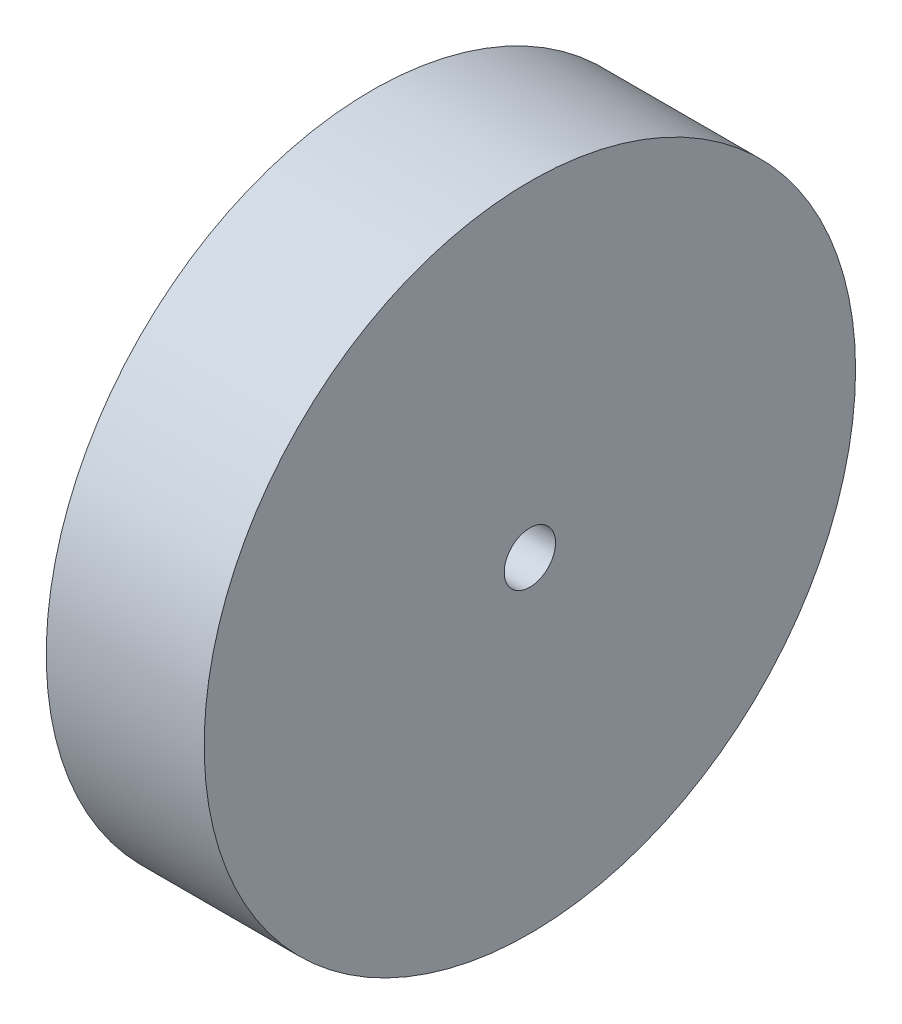
ISO-10303-21;
HEADER;
FILE_DESCRIPTION(('STEP AP214'),'2;1');
FILE_NAME('part.step','',(''),(''),'','','');
FILE_SCHEMA(('AUTOMOTIVE_DESIGN { 1 0 10303 214 1 1 1 1 }'));
ENDSEC;
DATA;
#1=APPLICATION_CONTEXT('core data for automotive mechanical design processes');
#2=APPLICATION_PROTOCOL_DEFINITION('international standard','automotive_design',2000,#1);
#3=PRODUCT_CONTEXT('',#1,'mechanical');
#4=PRODUCT('Part','Part','',(#3));
#5=PRODUCT_RELATED_PRODUCT_CATEGORY('part','',(#4));
#6=PRODUCT_DEFINITION_FORMATION('','',#4);
#7=PRODUCT_DEFINITION_CONTEXT('part definition',#1,'design');
#8=PRODUCT_DEFINITION('design','',#6,#7);
#9=PRODUCT_DEFINITION_SHAPE('','',#8);
#10=(LENGTH_UNIT() NAMED_UNIT(*) SI_UNIT(.MILLI.,.METRE.));
#11=(NAMED_UNIT(*) PLANE_ANGLE_UNIT() SI_UNIT($,.RADIAN.));
#12=(NAMED_UNIT(*) SI_UNIT($,.STERADIAN.) SOLID_ANGLE_UNIT());
#13=UNCERTAINTY_MEASURE_WITH_UNIT(LENGTH_MEASURE(1.E-05),#10,'distance_accuracy_value','');
#14=(GEOMETRIC_REPRESENTATION_CONTEXT(3) GLOBAL_UNCERTAINTY_ASSIGNED_CONTEXT((#13)) GLOBAL_UNIT_ASSIGNED_CONTEXT((#10,
#11,#12)) REPRESENTATION_CONTEXT('',''));
#15=CARTESIAN_POINT('',(0.,0.,0.));
#16=DIRECTION('',(0.,0.,1.));
#17=DIRECTION('',(1.,0.,0.));
#18=AXIS2_PLACEMENT_3D('',#15,#16,#17);
#19=CARTESIAN_POINT('',(16.,0.,0.));
#20=DIRECTION('',(-1.,0.,0.));
#21=DIRECTION('',(0.,0.,1.));
#22=AXIS2_PLACEMENT_3D('',#19,#20,#21);
#23=CYLINDRICAL_SURFACE('',#22,33.);
#24=CARTESIAN_POINT('',(16.,0.,0.));
#25=DIRECTION('',(1.,0.,0.));
#26=DIRECTION('',(0.,0.,-1.));
#27=AXIS2_PLACEMENT_3D('',#24,#25,#26);
#28=CIRCLE('',#27,33.);
#29=CARTESIAN_POINT('',(16.,0.,-33.));
#30=VERTEX_POINT('',#29);
#31=EDGE_CURVE('E10',#30,#30,#28,.T.);
#32=ORIENTED_EDGE('',*,*,#31,.F.);
#33=EDGE_LOOP('',(#32));
#34=FACE_BOUND('',#33,.T.);
#35=CARTESIAN_POINT('',(0.,0.,0.));
#36=DIRECTION('',(1.,0.,0.));
#37=DIRECTION('',(0.,0.,-1.));
#38=AXIS2_PLACEMENT_3D('',#35,#36,#37);
#39=CIRCLE('',#38,33.);
#40=CARTESIAN_POINT('',(0.,0.,-33.));
#41=VERTEX_POINT('',#40);
#42=EDGE_CURVE('E36',#41,#41,#39,.T.);
#43=ORIENTED_EDGE('',*,*,#42,.T.);
#44=EDGE_LOOP('',(#43));
#45=FACE_BOUND('',#44,.T.);
#46=ADVANCED_FACE('F33',(#34,#45),#23,.T.);
#47=CARTESIAN_POINT('',(16.,0.,0.));
#48=DIRECTION('',(1.,0.,0.));
#49=DIRECTION('',(0.,0.,-1.));
#50=AXIS2_PLACEMENT_3D('',#47,#48,#49);
#51=PLANE('',#50);
#52=CARTESIAN_POINT('',(16.,0.,0.));
#53=DIRECTION('',(1.,0.,0.));
#54=DIRECTION('',(0.,0.,-1.));
#55=AXIS2_PLACEMENT_3D('',#52,#53,#54);
#56=CIRCLE('',#55,2.6);
#57=CARTESIAN_POINT('',(16.,0.,-2.6));
#58=VERTEX_POINT('',#57);
#59=EDGE_CURVE('E45',#58,#58,#56,.T.);
#60=ORIENTED_EDGE('',*,*,#59,.F.);
#61=EDGE_LOOP('',(#60));
#62=FACE_BOUND('',#61,.T.);
#63=ORIENTED_EDGE('',*,*,#31,.T.);
#64=EDGE_LOOP('',(#63));
#65=FACE_BOUND('',#64,.T.);
#66=ADVANCED_FACE('F60',(#62,#65),#51,.T.);
#67=CARTESIAN_POINT('',(0.,0.,0.));
#68=DIRECTION('',(1.,0.,0.));
#69=DIRECTION('',(0.,0.,-1.));
#70=AXIS2_PLACEMENT_3D('',#67,#68,#69);
#71=PLANE('',#70);
#72=CARTESIAN_POINT('',(0.,0.,0.));
#73=DIRECTION('',(1.,0.,0.));
#74=DIRECTION('',(0.,0.,-1.));
#75=AXIS2_PLACEMENT_3D('',#72,#73,#74);
#76=CIRCLE('',#75,2.6);
#77=CARTESIAN_POINT('',(0.,0.,-2.6));
#78=VERTEX_POINT('',#77);
#79=EDGE_CURVE('E43',#78,#78,#76,.T.);
#80=ORIENTED_EDGE('',*,*,#79,.T.);
#81=EDGE_LOOP('',(#80));
#82=FACE_BOUND('',#81,.T.);
#83=ORIENTED_EDGE('',*,*,#42,.F.);
#84=EDGE_LOOP('',(#83));
#85=FACE_BOUND('',#84,.T.);
#86=ADVANCED_FACE('F51',(#82,#85),#71,.F.);
#87=CARTESIAN_POINT('',(0.,0.,0.));
#88=DIRECTION('',(1.,0.,0.));
#89=DIRECTION('',(0.,0.,-1.));
#90=AXIS2_PLACEMENT_3D('',#87,#88,#89);
#91=CYLINDRICAL_SURFACE('',#90,2.6);
#92=ORIENTED_EDGE('',*,*,#79,.F.);
#93=EDGE_LOOP('',(#92));
#94=FACE_BOUND('',#93,.T.);
#95=ORIENTED_EDGE('',*,*,#59,.T.);
#96=EDGE_LOOP('',(#95));
#97=FACE_BOUND('',#96,.T.);
#98=ADVANCED_FACE('F54',(#94,#97),#91,.F.);
#99=CLOSED_SHELL('',(#46,#66,#86,#98));
#100=MANIFOLD_SOLID_BREP('B2',#99);
#101=ADVANCED_BREP_SHAPE_REPRESENTATION('',(#18,#100),#14);
#102=SHAPE_DEFINITION_REPRESENTATION(#9,#101);
ENDSEC;
END-ISO-10303-21;
